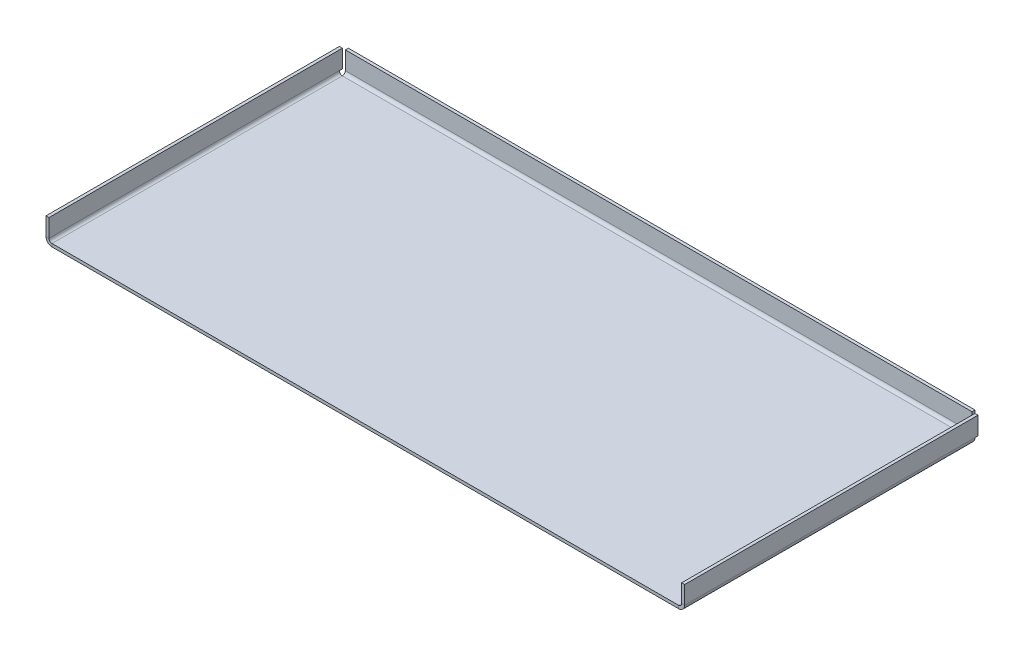
ISO-10303-21;
HEADER;
FILE_DESCRIPTION(('STEP AP214'),'2;1');
FILE_NAME('part.step','',(''),(''),'','','');
FILE_SCHEMA(('AUTOMOTIVE_DESIGN { 1 0 10303 214 1 1 1 1 }'));
ENDSEC;
DATA;
#1=APPLICATION_CONTEXT('core data for automotive mechanical design processes');
#2=APPLICATION_PROTOCOL_DEFINITION('international standard','automotive_design',2000,#1);
#3=PRODUCT_CONTEXT('',#1,'mechanical');
#4=PRODUCT('Part','Part','',(#3));
#5=PRODUCT_RELATED_PRODUCT_CATEGORY('part','',(#4));
#6=PRODUCT_DEFINITION_FORMATION('','',#4);
#7=PRODUCT_DEFINITION_CONTEXT('part definition',#1,'design');
#8=PRODUCT_DEFINITION('design','',#6,#7);
#9=PRODUCT_DEFINITION_SHAPE('','',#8);
#10=(LENGTH_UNIT() NAMED_UNIT(*) SI_UNIT(.MILLI.,.METRE.));
#11=(NAMED_UNIT(*) PLANE_ANGLE_UNIT() SI_UNIT($,.RADIAN.));
#12=(NAMED_UNIT(*) SI_UNIT($,.STERADIAN.) SOLID_ANGLE_UNIT());
#13=UNCERTAINTY_MEASURE_WITH_UNIT(LENGTH_MEASURE(1.E-05),#10,'distance_accuracy_value','');
#14=(GEOMETRIC_REPRESENTATION_CONTEXT(3) GLOBAL_UNCERTAINTY_ASSIGNED_CONTEXT((#13)) GLOBAL_UNIT_ASSIGNED_CONTEXT((#10,
#11,#12)) REPRESENTATION_CONTEXT('',''));
#15=CARTESIAN_POINT('',(0.,0.,0.));
#16=DIRECTION('',(0.,0.,1.));
#17=DIRECTION('',(1.,0.,0.));
#18=AXIS2_PLACEMENT_3D('',#15,#16,#17);
#19=CARTESIAN_POINT('',(0.,3.17499999999998,0.));
#20=DIRECTION('',(0.,-1.,0.));
#21=DIRECTION('',(1.,0.,0.));
#22=AXIS2_PLACEMENT_3D('',#19,#20,#21);
#23=PLANE('',#22);
#24=DIRECTION('',(1.,0.,0.));
#25=VECTOR('',#24,1.);
#26=CARTESIAN_POINT('',(0.,3.17499999999998,-307.467));
#27=LINE('',#26,#25);
#28=CARTESIAN_POINT('',(0.,3.17499999999998,-307.467));
#29=VERTEX_POINT('',#28);
#30=CARTESIAN_POINT('',(3.17499999999999,3.17499999999999,-307.467));
#31=VERTEX_POINT('',#30);
#32=EDGE_CURVE('E13',#29,#31,#27,.T.);
#33=ORIENTED_EDGE('',*,*,#32,.F.);
#34=DIRECTION('',(0.,0.,1.));
#35=VECTOR('',#34,1.);
#36=CARTESIAN_POINT('',(0.,3.17499999999998,0.));
#37=LINE('',#36,#35);
#38=CARTESIAN_POINT('',(0.,3.17499999999998,-310.642));
#39=VERTEX_POINT('',#38);
#40=EDGE_CURVE('E289',#39,#29,#37,.T.);
#41=ORIENTED_EDGE('',*,*,#40,.F.);
#42=DIRECTION('',(1.,0.,0.));
#43=VECTOR('',#42,1.);
#44=CARTESIAN_POINT('',(0.,3.17499999999998,-310.642));
#45=LINE('',#44,#43);
#46=CARTESIAN_POINT('',(3.17499999999999,3.17499999999999,-310.642));
#47=VERTEX_POINT('',#46);
#48=EDGE_CURVE('E265',#47,#39,#45,.F.);
#49=ORIENTED_EDGE('',*,*,#48,.F.);
#50=DIRECTION('',(0.,0.,-1.));
#51=VECTOR('',#50,1.);
#52=CARTESIAN_POINT('',(3.17499999999999,3.17499999999999,-310.642));
#53=LINE('',#52,#51);
#54=EDGE_CURVE('E296',#47,#31,#53,.F.);
#55=ORIENTED_EDGE('',*,*,#54,.T.);
#56=EDGE_LOOP('',(#33,#41,#49,#55));
#57=FACE_BOUND('',#56,.T.);
#58=ADVANCED_FACE('F82',(#57),#23,.T.);
#59=CARTESIAN_POINT('',(6.35000000000001,3.175,0.));
#60=DIRECTION('',(0.,0.,1.));
#61=DIRECTION('',(-1.,0.,0.));
#62=AXIS2_PLACEMENT_3D('',#59,#60,#61);
#63=CYLINDRICAL_SURFACE('',#62,6.34999999999998);
#64=CARTESIAN_POINT('',(0.,3.17499999999998,0.));
#65=VERTEX_POINT('',#64);
#66=EDGE_CURVE('E292',#29,#65,#37,.T.);
#67=ORIENTED_EDGE('',*,*,#66,.F.);
#68=CARTESIAN_POINT('',(6.34999999999997,3.175,-307.467));
#69=DIRECTION('',(0.,0.,-1.));
#70=DIRECTION('',(0.,1.,0.));
#71=AXIS2_PLACEMENT_3D('',#68,#69,#70);
#72=CIRCLE('',#71,6.34999999999998);
#73=CARTESIAN_POINT('',(6.34999999999985,-3.17500000000051,-307.467));
#74=VERTEX_POINT('',#73);
#75=EDGE_CURVE('E375',#29,#74,#72,.F.);
#76=ORIENTED_EDGE('',*,*,#75,.T.);
#77=DIRECTION('',(0.,0.,1.));
#78=VECTOR('',#77,1.);
#79=CARTESIAN_POINT('',(6.34999999999997,-3.17499999999998,0.));
#80=LINE('',#79,#78);
#81=CARTESIAN_POINT('',(6.34999999999997,-3.17499999999998,0.));
#82=VERTEX_POINT('',#81);
#83=EDGE_CURVE('E301',#82,#74,#80,.F.);
#84=ORIENTED_EDGE('',*,*,#83,.F.);
#85=CARTESIAN_POINT('',(6.35000000000001,3.175,0.));
#86=DIRECTION('',(0.,0.,1.));
#87=DIRECTION('',(1.,0.,0.));
#88=AXIS2_PLACEMENT_3D('',#85,#86,#87);
#89=CIRCLE('',#88,6.34999999999998);
#90=EDGE_CURVE('E305',#65,#82,#89,.T.);
#91=ORIENTED_EDGE('',*,*,#90,.F.);
#92=EDGE_LOOP('',(#67,#76,#84,#91));
#93=FACE_BOUND('',#92,.T.);
#94=ADVANCED_FACE('F409',(#93),#63,.T.);
#95=CARTESIAN_POINT('',(0.,3.17500000000344,0.));
#96=DIRECTION('',(0.,1.,0.));
#97=DIRECTION('',(-1.,0.,0.));
#98=AXIS2_PLACEMENT_3D('',#95,#96,#97);
#99=PLANE('',#98);
#100=DIRECTION('',(1.,0.,0.));
#101=VECTOR('',#100,1.);
#102=CARTESIAN_POINT('',(673.110159999999,3.17500000000004,-307.467));
#103=LINE('',#102,#101);
#104=CARTESIAN_POINT('',(673.110159999999,3.17500000000004,-307.467));
#105=VERTEX_POINT('',#104);
#106=CARTESIAN_POINT('',(676.285159999999,3.17500000000002,-307.467));
#107=VERTEX_POINT('',#106);
#108=EDGE_CURVE('E373',#105,#107,#103,.T.);
#109=ORIENTED_EDGE('',*,*,#108,.F.);
#110=DIRECTION('',(0.,0.,-1.));
#111=VECTOR('',#110,1.);
#112=CARTESIAN_POINT('',(673.110160000001,3.17500000000004,-1.43659402730918E-12));
#113=LINE('',#112,#111);
#114=CARTESIAN_POINT('',(673.110160000001,3.17500000000004,-310.642));
#115=VERTEX_POINT('',#114);
#116=EDGE_CURVE('E346',#105,#115,#113,.T.);
#117=ORIENTED_EDGE('',*,*,#116,.T.);
#118=DIRECTION('',(-1.,0.,0.));
#119=VECTOR('',#118,1.);
#120=CARTESIAN_POINT('',(673.110159999999,3.17500000000004,-310.642));
#121=LINE('',#120,#119);
#122=CARTESIAN_POINT('',(676.285159999999,3.17500000000002,-310.642));
#123=VERTEX_POINT('',#122);
#124=EDGE_CURVE('E341',#115,#123,#121,.F.);
#125=ORIENTED_EDGE('',*,*,#124,.T.);
#126=DIRECTION('',(0.,0.,-1.));
#127=VECTOR('',#126,1.);
#128=CARTESIAN_POINT('',(676.285160000001,3.17500000000002,-1.45021082646648E-12));
#129=LINE('',#128,#127);
#130=EDGE_CURVE('E337',#123,#107,#129,.F.);
#131=ORIENTED_EDGE('',*,*,#130,.T.);
#132=EDGE_LOOP('',(#109,#117,#125,#131));
#133=FACE_BOUND('',#132,.T.);
#134=ADVANCED_FACE('F448',(#133),#99,.F.);
#135=CARTESIAN_POINT('',(669.93516,3.17500000000005,-310.642));
#136=DIRECTION('',(0.,0.,-1.));
#137=DIRECTION('',(1.,0.,0.));
#138=AXIS2_PLACEMENT_3D('',#135,#136,#137);
#139=CYLINDRICAL_SURFACE('',#138,6.3500000000007);
#140=DIRECTION('',(0.,0.,-1.));
#141=VECTOR('',#140,1.);
#142=CARTESIAN_POINT('',(669.935159999999,-3.17500000000065,-310.642));
#143=LINE('',#142,#141);
#144=CARTESIAN_POINT('',(669.935159999999,-3.17500000000065,-307.467));
#145=VERTEX_POINT('',#144);
#146=CARTESIAN_POINT('',(669.935159999999,-3.175,0.));
#147=VERTEX_POINT('',#146);
#148=EDGE_CURVE('E349',#145,#147,#143,.F.);
#149=ORIENTED_EDGE('',*,*,#148,.F.);
#150=CARTESIAN_POINT('',(669.93516,3.17500000000005,-307.467));
#151=DIRECTION('',(0.,0.,-1.));
#152=DIRECTION('',(0.,1.,0.));
#153=AXIS2_PLACEMENT_3D('',#150,#151,#152);
#154=CIRCLE('',#153,6.3500000000007);
#155=EDGE_CURVE('E370',#145,#107,#154,.F.);
#156=ORIENTED_EDGE('',*,*,#155,.T.);
#157=CARTESIAN_POINT('',(676.285160000001,3.17500000000002,0.));
#158=VERTEX_POINT('',#157);
#159=EDGE_CURVE('E340',#107,#158,#129,.F.);
#160=ORIENTED_EDGE('',*,*,#159,.T.);
#161=CARTESIAN_POINT('',(669.93516,3.17500000000005,0.));
#162=DIRECTION('',(0.,0.,-1.));
#163=DIRECTION('',(-1.,0.,0.));
#164=AXIS2_PLACEMENT_3D('',#161,#162,#163);
#165=CIRCLE('',#164,6.3500000000007);
#166=EDGE_CURVE('E351',#147,#158,#165,.F.);
#167=ORIENTED_EDGE('',*,*,#166,.F.);
#168=EDGE_LOOP('',(#149,#156,#160,#167));
#169=FACE_BOUND('',#168,.T.);
#170=ADVANCED_FACE('F419',(#169),#139,.T.);
#171=CARTESIAN_POINT('',(669.93516,3.17500000000005,-307.467));
#172=DIRECTION('',(0.,0.,-1.));
#173=DIRECTION('',(0.,1.,0.));
#174=AXIS2_PLACEMENT_3D('',#171,#172,#173);
#175=PLANE('',#174);
#176=CARTESIAN_POINT('',(669.93516,3.17500000000005,-307.467));
#177=DIRECTION('',(0.,0.,-1.));
#178=DIRECTION('',(0.,1.,0.));
#179=AXIS2_PLACEMENT_3D('',#176,#177,#178);
#180=CIRCLE('',#179,3.17500000000071);
#181=CARTESIAN_POINT('',(669.935159999999,-1.1440501324067E-12,-307.467));
#182=VERTEX_POINT('',#181);
#183=EDGE_CURVE('E365',#182,#105,#180,.F.);
#184=ORIENTED_EDGE('',*,*,#183,.T.);
#185=ORIENTED_EDGE('',*,*,#108,.T.);
#186=ORIENTED_EDGE('',*,*,#155,.F.);
#187=DIRECTION('',(0.,-1.,0.));
#188=VECTOR('',#187,1.);
#189=CARTESIAN_POINT('',(669.935159999999,-1.1440501324067E-12,-307.467));
#190=LINE('',#189,#188);
#191=EDGE_CURVE('E262',#182,#145,#190,.T.);
#192=ORIENTED_EDGE('',*,*,#191,.F.);
#193=EDGE_LOOP('',(#184,#185,#186,#192));
#194=FACE_BOUND('',#193,.T.);
#195=ADVANCED_FACE('F486',(#194),#175,.T.);
#196=CARTESIAN_POINT('',(0.,-3.175,0.));
#197=DIRECTION('',(0.,-1.,0.));
#198=DIRECTION('',(0.,0.,-1.));
#199=AXIS2_PLACEMENT_3D('',#196,#197,#198);
#200=PLANE('',#199);
#201=ORIENTED_EDGE('',*,*,#83,.T.);
#202=DIRECTION('',(-1.,0.,0.));
#203=VECTOR('',#202,1.);
#204=CARTESIAN_POINT('',(6.34999999999985,-3.17500000000051,-307.467));
#205=LINE('',#204,#203);
#206=EDGE_CURVE('E209',#74,#145,#205,.F.);
#207=ORIENTED_EDGE('',*,*,#206,.T.);
#208=ORIENTED_EDGE('',*,*,#148,.T.);
#209=DIRECTION('',(1.,0.,0.));
#210=VECTOR('',#209,1.);
#211=CARTESIAN_POINT('',(0.,-3.175,0.));
#212=LINE('',#211,#210);
#213=EDGE_CURVE('E362',#82,#147,#212,.T.);
#214=ORIENTED_EDGE('',*,*,#213,.F.);
#215=EDGE_LOOP('',(#201,#207,#208,#214));
#216=FACE_BOUND('',#215,.T.);
#217=ADVANCED_FACE('F415',(#216),#200,.T.);
#218=CARTESIAN_POINT('',(0.,0.,0.));
#219=DIRECTION('',(0.,-1.,0.));
#220=DIRECTION('',(0.,0.,-1.));
#221=AXIS2_PLACEMENT_3D('',#218,#219,#220);
#222=PLANE('',#221);
#223=DIRECTION('',(-1.,0.,0.));
#224=VECTOR('',#223,1.);
#225=CARTESIAN_POINT('',(6.34999999999985,-5.09575021068187E-13,-307.467));
#226=LINE('',#225,#224);
#227=CARTESIAN_POINT('',(6.34999999999985,-5.09575021068187E-13,-307.467));
#228=VERTEX_POINT('',#227);
#229=EDGE_CURVE('E259',#228,#182,#226,.F.);
#230=ORIENTED_EDGE('',*,*,#229,.F.);
#231=DIRECTION('',(0.,0.,1.));
#232=VECTOR('',#231,1.);
#233=CARTESIAN_POINT('',(6.34999999999999,0.,0.));
#234=LINE('',#233,#232);
#235=CARTESIAN_POINT('',(6.34999999999999,0.,0.));
#236=VERTEX_POINT('',#235);
#237=EDGE_CURVE('E308',#236,#228,#234,.F.);
#238=ORIENTED_EDGE('',*,*,#237,.F.);
#239=DIRECTION('',(1.,0.,0.));
#240=VECTOR('',#239,1.);
#241=CARTESIAN_POINT('',(0.,0.,0.));
#242=LINE('',#241,#240);
#243=CARTESIAN_POINT('',(669.935159999999,-6.50087622622308E-13,0.));
#244=VERTEX_POINT('',#243);
#245=EDGE_CURVE('E361',#236,#244,#242,.T.);
#246=ORIENTED_EDGE('',*,*,#245,.T.);
#247=DIRECTION('',(0.,0.,-1.));
#248=VECTOR('',#247,1.);
#249=CARTESIAN_POINT('',(669.935159999999,-6.50087622622308E-13,-310.642));
#250=LINE('',#249,#248);
#251=EDGE_CURVE('E319',#182,#244,#250,.F.);
#252=ORIENTED_EDGE('',*,*,#251,.F.);
#253=EDGE_LOOP('',(#230,#238,#246,#252));
#254=FACE_BOUND('',#253,.T.);
#255=ADVANCED_FACE('F383',(#254),#222,.F.);
#256=CARTESIAN_POINT('',(0.,-3.175,0.));
#257=DIRECTION('',(0.,0.,1.));
#258=DIRECTION('',(1.,0.,0.));
#259=AXIS2_PLACEMENT_3D('',#256,#257,#258);
#260=PLANE('',#259);
#261=ORIENTED_EDGE('',*,*,#245,.F.);
#262=DIRECTION('',(0.,-1.,0.));
#263=VECTOR('',#262,1.);
#264=CARTESIAN_POINT('',(6.34999999999999,0.,0.));
#265=LINE('',#264,#263);
#266=EDGE_CURVE('E304',#236,#82,#265,.T.);
#267=ORIENTED_EDGE('',*,*,#266,.T.);
#268=ORIENTED_EDGE('',*,*,#213,.T.);
#269=DIRECTION('',(-2.09805925913369E-13,-1.,0.));
#270=VECTOR('',#269,1.);
#271=CARTESIAN_POINT('',(669.935159999999,-6.50087622622308E-13,0.));
#272=LINE('',#271,#270);
#273=EDGE_CURVE('E355',#244,#147,#272,.T.);
#274=ORIENTED_EDGE('',*,*,#273,.F.);
#275=EDGE_LOOP('',(#261,#267,#268,#274));
#276=FACE_BOUND('',#275,.T.);
#277=ADVANCED_FACE('F412',(#276),#260,.T.);
#278=CARTESIAN_POINT('',(669.93516,3.17500000000005,0.));
#279=DIRECTION('',(0.,0.,1.));
#280=DIRECTION('',(1.,0.,0.));
#281=AXIS2_PLACEMENT_3D('',#278,#279,#280);
#282=PLANE('',#281);
#283=DIRECTION('',(-1.,0.,0.));
#284=VECTOR('',#283,1.);
#285=CARTESIAN_POINT('',(676.285160000001,3.17500000000002,-4.14345970608878E-13));
#286=LINE('',#285,#284);
#287=CARTESIAN_POINT('',(673.110160000001,3.17500000000004,0.));
#288=VERTEX_POINT('',#287);
#289=EDGE_CURVE('E315',#288,#158,#286,.F.);
#290=ORIENTED_EDGE('',*,*,#289,.F.);
#291=CARTESIAN_POINT('',(669.93516,3.17500000000005,0.));
#292=DIRECTION('',(0.,0.,-1.));
#293=DIRECTION('',(-1.,0.,0.));
#294=AXIS2_PLACEMENT_3D('',#291,#292,#293);
#295=CIRCLE('',#294,3.17500000000071);
#296=EDGE_CURVE('E352',#244,#288,#295,.F.);
#297=ORIENTED_EDGE('',*,*,#296,.F.);
#298=ORIENTED_EDGE('',*,*,#273,.T.);
#299=ORIENTED_EDGE('',*,*,#166,.T.);
#300=EDGE_LOOP('',(#290,#297,#298,#299));
#301=FACE_BOUND('',#300,.T.);
#302=ADVANCED_FACE('F423',(#301),#282,.T.);
#303=CARTESIAN_POINT('',(669.93516,3.17500000000005,-310.642));
#304=DIRECTION('',(0.,0.,-1.));
#305=DIRECTION('',(1.,0.,0.));
#306=AXIS2_PLACEMENT_3D('',#303,#304,#305);
#307=CYLINDRICAL_SURFACE('',#306,3.17500000000071);
#308=ORIENTED_EDGE('',*,*,#183,.F.);
#309=ORIENTED_EDGE('',*,*,#251,.T.);
#310=ORIENTED_EDGE('',*,*,#296,.T.);
#311=EDGE_CURVE('E343',#288,#105,#113,.T.);
#312=ORIENTED_EDGE('',*,*,#311,.T.);
#313=EDGE_LOOP('',(#308,#309,#310,#312));
#314=FACE_BOUND('',#313,.T.);
#315=ADVANCED_FACE('F427',(#314),#307,.F.);
#316=CARTESIAN_POINT('',(676.28516,22.225,-310.642));
#317=DIRECTION('',(0.,0.,1.));
#318=DIRECTION('',(1.,0.,0.));
#319=AXIS2_PLACEMENT_3D('',#316,#317,#318);
#320=PLANE('',#319);
#321=ORIENTED_EDGE('',*,*,#124,.F.);
#322=DIRECTION('',(0.,-1.,0.));
#323=VECTOR('',#322,1.);
#324=CARTESIAN_POINT('',(673.11016,22.225,-310.642));
#325=LINE('',#324,#323);
#326=CARTESIAN_POINT('',(673.11016,22.225,-310.642));
#327=VERTEX_POINT('',#326);
#328=EDGE_CURVE('E335',#115,#327,#325,.F.);
#329=ORIENTED_EDGE('',*,*,#328,.T.);
#330=DIRECTION('',(-1.,0.,0.));
#331=VECTOR('',#330,1.);
#332=CARTESIAN_POINT('',(676.28516,22.225,-310.642));
#333=LINE('',#332,#331);
#334=CARTESIAN_POINT('',(676.28516,22.225,-310.642));
#335=VERTEX_POINT('',#334);
#336=EDGE_CURVE('E316',#335,#327,#333,.T.);
#337=ORIENTED_EDGE('',*,*,#336,.F.);
#338=DIRECTION('',(0.,1.,0.));
#339=VECTOR('',#338,1.);
#340=CARTESIAN_POINT('',(676.285159999999,-3.3893862669485E-12,-310.642));
#341=LINE('',#340,#339);
#342=EDGE_CURVE('E328',#123,#335,#341,.T.);
#343=ORIENTED_EDGE('',*,*,#342,.F.);
#344=EDGE_LOOP('',(#321,#329,#337,#343));
#345=FACE_BOUND('',#344,.T.);
#346=ADVANCED_FACE('F444',(#345),#320,.F.);
#347=CARTESIAN_POINT('',(676.285160000001,0.,0.));
#348=DIRECTION('',(0.,-1.30502667908306E-13,-1.));
#349=DIRECTION('',(0.,1.,-1.30502667908306E-13));
#350=AXIS2_PLACEMENT_3D('',#347,#348,#349);
#351=PLANE('',#350);
#352=ORIENTED_EDGE('',*,*,#289,.T.);
#353=DIRECTION('',(0.,-1.,1.30502667908306E-13));
#354=VECTOR('',#353,1.);
#355=CARTESIAN_POINT('',(676.285160000001,-3.3893862669485E-12,-2.90042179426211E-12));
#356=LINE('',#355,#354);
#357=CARTESIAN_POINT('',(676.285160000001,22.225,-4.35063269139339E-12));
#358=VERTEX_POINT('',#357);
#359=EDGE_CURVE('E323',#358,#158,#356,.T.);
#360=ORIENTED_EDGE('',*,*,#359,.F.);
#361=DIRECTION('',(-1.,0.,0.));
#362=VECTOR('',#361,1.);
#363=CARTESIAN_POINT('',(676.285160000001,22.225,-2.90042179426211E-12));
#364=LINE('',#363,#362);
#365=CARTESIAN_POINT('',(673.110160000001,22.225,-2.88680499510481E-12));
#366=VERTEX_POINT('',#365);
#367=EDGE_CURVE('E320',#358,#366,#364,.T.);
#368=ORIENTED_EDGE('',*,*,#367,.T.);
#369=DIRECTION('',(0.,1.,-1.30502667908306E-13));
#370=VECTOR('',#369,1.);
#371=CARTESIAN_POINT('',(673.110160000001,0.,0.));
#372=LINE('',#371,#370);
#373=EDGE_CURVE('E330',#366,#288,#372,.F.);
#374=ORIENTED_EDGE('',*,*,#373,.T.);
#375=EDGE_LOOP('',(#352,#360,#368,#374));
#376=FACE_BOUND('',#375,.T.);
#377=ADVANCED_FACE('F435',(#376),#351,.F.);
#378=CARTESIAN_POINT('',(676.285160000001,-3.3893862669485E-12,-2.90042179426211E-12));
#379=DIRECTION('',(-1.,0.,0.));
#380=DIRECTION('',(0.,-1.,0.));
#381=AXIS2_PLACEMENT_3D('',#378,#379,#380);
#382=PLANE('',#381);
#383=ORIENTED_EDGE('',*,*,#130,.F.);
#384=ORIENTED_EDGE('',*,*,#342,.T.);
#385=DIRECTION('',(0.,0.,1.));
#386=VECTOR('',#385,1.);
#387=CARTESIAN_POINT('',(676.285160000001,22.225,-2.90042179426211E-12));
#388=LINE('',#387,#386);
#389=EDGE_CURVE('E326',#335,#358,#388,.T.);
#390=ORIENTED_EDGE('',*,*,#389,.T.);
#391=ORIENTED_EDGE('',*,*,#359,.T.);
#392=ORIENTED_EDGE('',*,*,#159,.F.);
#393=EDGE_LOOP('',(#383,#384,#390,#391,#392));
#394=FACE_BOUND('',#393,.T.);
#395=ADVANCED_FACE('F450',(#394),#382,.F.);
#396=CARTESIAN_POINT('',(673.110160000001,-3.37830081369768E-12,-2.88680499510481E-12));
#397=DIRECTION('',(-1.,0.,0.));
#398=DIRECTION('',(0.,-1.,0.));
#399=AXIS2_PLACEMENT_3D('',#396,#397,#398);
#400=PLANE('',#399);
#401=ORIENTED_EDGE('',*,*,#328,.F.);
#402=ORIENTED_EDGE('',*,*,#116,.F.);
#403=ORIENTED_EDGE('',*,*,#311,.F.);
#404=ORIENTED_EDGE('',*,*,#373,.F.);
#405=DIRECTION('',(0.,0.,-1.));
#406=VECTOR('',#405,1.);
#407=CARTESIAN_POINT('',(673.110160000001,22.225,-2.88680499510481E-12));
#408=LINE('',#407,#406);
#409=EDGE_CURVE('E333',#327,#366,#408,.F.);
#410=ORIENTED_EDGE('',*,*,#409,.F.);
#411=EDGE_LOOP('',(#401,#402,#403,#404,#410));
#412=FACE_BOUND('',#411,.T.);
#413=ADVANCED_FACE('F432',(#412),#400,.T.);
#414=CARTESIAN_POINT('',(676.285160000001,22.225,-2.90042179426211E-12));
#415=DIRECTION('',(0.,-1.,0.));
#416=DIRECTION('',(1.,0.,0.));
#417=AXIS2_PLACEMENT_3D('',#414,#415,#416);
#418=PLANE('',#417);
#419=ORIENTED_EDGE('',*,*,#409,.T.);
#420=ORIENTED_EDGE('',*,*,#367,.F.);
#421=ORIENTED_EDGE('',*,*,#389,.F.);
#422=ORIENTED_EDGE('',*,*,#336,.T.);
#423=EDGE_LOOP('',(#419,#420,#421,#422));
#424=FACE_BOUND('',#423,.T.);
#425=ADVANCED_FACE('F440',(#424),#418,.F.);
#426=CARTESIAN_POINT('',(6.35000000000001,3.175,0.));
#427=DIRECTION('',(0.,0.,-1.));
#428=DIRECTION('',(-1.,0.,0.));
#429=AXIS2_PLACEMENT_3D('',#426,#427,#428);
#430=PLANE('',#429);
#431=CARTESIAN_POINT('',(6.35000000000001,3.175,0.));
#432=DIRECTION('',(0.,0.,1.));
#433=DIRECTION('',(1.,0.,0.));
#434=AXIS2_PLACEMENT_3D('',#431,#432,#433);
#435=CIRCLE('',#434,3.17499999999998);
#436=CARTESIAN_POINT('',(3.17500000000003,3.17499999999999,0.));
#437=VERTEX_POINT('',#436);
#438=EDGE_CURVE('E271',#437,#236,#435,.T.);
#439=ORIENTED_EDGE('',*,*,#438,.F.);
#440=DIRECTION('',(1.,0.,0.));
#441=VECTOR('',#440,1.);
#442=CARTESIAN_POINT('',(3.17499999999999,3.17499999999999,0.));
#443=LINE('',#442,#441);
#444=EDGE_CURVE('E293',#437,#65,#443,.F.);
#445=ORIENTED_EDGE('',*,*,#444,.T.);
#446=ORIENTED_EDGE('',*,*,#90,.T.);
#447=ORIENTED_EDGE('',*,*,#266,.F.);
#448=EDGE_LOOP('',(#439,#445,#446,#447));
#449=FACE_BOUND('',#448,.T.);
#450=ADVANCED_FACE('F391',(#449),#430,.F.);
#451=CARTESIAN_POINT('',(6.34999999999997,3.175,-307.467));
#452=DIRECTION('',(0.,0.,-1.));
#453=DIRECTION('',(0.,1.,0.));
#454=AXIS2_PLACEMENT_3D('',#451,#452,#453);
#455=PLANE('',#454);
#456=ORIENTED_EDGE('',*,*,#75,.F.);
#457=ORIENTED_EDGE('',*,*,#32,.T.);
#458=CARTESIAN_POINT('',(6.34999999999997,3.175,-307.467));
#459=DIRECTION('',(0.,0.,-1.));
#460=DIRECTION('',(0.,1.,0.));
#461=AXIS2_PLACEMENT_3D('',#458,#459,#460);
#462=CIRCLE('',#461,3.17499999999998);
#463=EDGE_CURVE('E89',#31,#228,#462,.F.);
#464=ORIENTED_EDGE('',*,*,#463,.T.);
#465=DIRECTION('',(0.,-1.,0.));
#466=VECTOR('',#465,1.);
#467=CARTESIAN_POINT('',(6.34999999999985,-5.09575021068187E-13,-307.467));
#468=LINE('',#467,#466);
#469=EDGE_CURVE('E255',#228,#74,#468,.T.);
#470=ORIENTED_EDGE('',*,*,#469,.T.);
#471=EDGE_LOOP('',(#456,#457,#464,#470));
#472=FACE_BOUND('',#471,.T.);
#473=ADVANCED_FACE('F377',(#472),#455,.T.);
#474=CARTESIAN_POINT('',(6.35000000000001,3.175,0.));
#475=DIRECTION('',(0.,0.,1.));
#476=DIRECTION('',(-1.,0.,0.));
#477=AXIS2_PLACEMENT_3D('',#474,#475,#476);
#478=CYLINDRICAL_SURFACE('',#477,3.17499999999998);
#479=ORIENTED_EDGE('',*,*,#463,.F.);
#480=EDGE_CURVE('E298',#31,#437,#53,.F.);
#481=ORIENTED_EDGE('',*,*,#480,.T.);
#482=ORIENTED_EDGE('',*,*,#438,.T.);
#483=ORIENTED_EDGE('',*,*,#237,.T.);
#484=EDGE_LOOP('',(#479,#481,#482,#483));
#485=FACE_BOUND('',#484,.T.);
#486=ADVANCED_FACE('F387',(#485),#478,.F.);
#487=CARTESIAN_POINT('',(0.,0.,0.));
#488=DIRECTION('',(0.,0.,-1.));
#489=DIRECTION('',(0.,1.,0.));
#490=AXIS2_PLACEMENT_3D('',#487,#488,#489);
#491=PLANE('',#490);
#492=ORIENTED_EDGE('',*,*,#444,.F.);
#493=DIRECTION('',(0.,1.,0.));
#494=VECTOR('',#493,1.);
#495=CARTESIAN_POINT('',(3.175,0.,0.));
#496=LINE('',#495,#494);
#497=CARTESIAN_POINT('',(3.17499999999992,22.225,0.));
#498=VERTEX_POINT('',#497);
#499=EDGE_CURVE('E287',#437,#498,#496,.T.);
#500=ORIENTED_EDGE('',*,*,#499,.T.);
#501=DIRECTION('',(1.,0.,0.));
#502=VECTOR('',#501,1.);
#503=CARTESIAN_POINT('',(0.,22.225,0.));
#504=LINE('',#503,#502);
#505=CARTESIAN_POINT('',(0.,22.225,0.));
#506=VERTEX_POINT('',#505);
#507=EDGE_CURVE('E268',#506,#498,#504,.T.);
#508=ORIENTED_EDGE('',*,*,#507,.F.);
#509=DIRECTION('',(0.,-1.,0.));
#510=VECTOR('',#509,1.);
#511=CARTESIAN_POINT('',(0.,0.,0.));
#512=LINE('',#511,#510);
#513=EDGE_CURVE('E280',#65,#506,#512,.F.);
#514=ORIENTED_EDGE('',*,*,#513,.F.);
#515=EDGE_LOOP('',(#492,#500,#508,#514));
#516=FACE_BOUND('',#515,.T.);
#517=ADVANCED_FACE('F401',(#516),#491,.F.);
#518=CARTESIAN_POINT('',(0.,22.225,-310.642));
#519=DIRECTION('',(0.,0.,1.));
#520=DIRECTION('',(1.,0.,0.));
#521=AXIS2_PLACEMENT_3D('',#518,#519,#520);
#522=PLANE('',#521);
#523=ORIENTED_EDGE('',*,*,#48,.T.);
#524=DIRECTION('',(0.,1.,0.));
#525=VECTOR('',#524,1.);
#526=CARTESIAN_POINT('',(0.,0.,-310.642));
#527=LINE('',#526,#525);
#528=CARTESIAN_POINT('',(0.,22.225,-310.642));
#529=VERTEX_POINT('',#528);
#530=EDGE_CURVE('E275',#529,#39,#527,.F.);
#531=ORIENTED_EDGE('',*,*,#530,.F.);
#532=DIRECTION('',(1.,0.,0.));
#533=VECTOR('',#532,1.);
#534=CARTESIAN_POINT('',(0.,22.225,-310.642));
#535=LINE('',#534,#533);
#536=CARTESIAN_POINT('',(3.17499999999992,22.225,-310.642));
#537=VERTEX_POINT('',#536);
#538=EDGE_CURVE('E272',#529,#537,#535,.T.);
#539=ORIENTED_EDGE('',*,*,#538,.T.);
#540=DIRECTION('',(0.,-1.,0.));
#541=VECTOR('',#540,1.);
#542=CARTESIAN_POINT('',(3.17499999999992,22.225,-310.642));
#543=LINE('',#542,#541);
#544=EDGE_CURVE('E282',#537,#47,#543,.T.);
#545=ORIENTED_EDGE('',*,*,#544,.T.);
#546=EDGE_LOOP('',(#523,#531,#539,#545));
#547=FACE_BOUND('',#546,.T.);
#548=ADVANCED_FACE('F542',(#547),#522,.F.);
#549=CARTESIAN_POINT('',(0.,0.,0.));
#550=DIRECTION('',(-1.,0.,0.));
#551=DIRECTION('',(0.,-1.,0.));
#552=AXIS2_PLACEMENT_3D('',#549,#550,#551);
#553=PLANE('',#552);
#554=ORIENTED_EDGE('',*,*,#530,.T.);
#555=ORIENTED_EDGE('',*,*,#40,.T.);
#556=ORIENTED_EDGE('',*,*,#66,.T.);
#557=ORIENTED_EDGE('',*,*,#513,.T.);
#558=DIRECTION('',(0.,0.,1.));
#559=VECTOR('',#558,1.);
#560=CARTESIAN_POINT('',(0.,22.225,0.));
#561=LINE('',#560,#559);
#562=EDGE_CURVE('E278',#506,#529,#561,.F.);
#563=ORIENTED_EDGE('',*,*,#562,.T.);
#564=EDGE_LOOP('',(#554,#555,#556,#557,#563));
#565=FACE_BOUND('',#564,.T.);
#566=ADVANCED_FACE('F404',(#565),#553,.T.);
#567=CARTESIAN_POINT('',(3.175,0.,0.));
#568=DIRECTION('',(-1.,0.,0.));
#569=DIRECTION('',(0.,-1.,0.));
#570=AXIS2_PLACEMENT_3D('',#567,#568,#569);
#571=PLANE('',#570);
#572=ORIENTED_EDGE('',*,*,#54,.F.);
#573=ORIENTED_EDGE('',*,*,#544,.F.);
#574=DIRECTION('',(0.,0.,-1.));
#575=VECTOR('',#574,1.);
#576=CARTESIAN_POINT('',(3.17499999999992,22.225,0.));
#577=LINE('',#576,#575);
#578=EDGE_CURVE('E285',#498,#537,#577,.T.);
#579=ORIENTED_EDGE('',*,*,#578,.F.);
#580=ORIENTED_EDGE('',*,*,#499,.F.);
#581=ORIENTED_EDGE('',*,*,#480,.F.);
#582=EDGE_LOOP('',(#572,#573,#579,#580,#581));
#583=FACE_BOUND('',#582,.T.);
#584=ADVANCED_FACE('F397',(#583),#571,.F.);
#585=CARTESIAN_POINT('',(0.,22.225,0.));
#586=DIRECTION('',(0.,-1.,0.));
#587=DIRECTION('',(1.,0.,0.));
#588=AXIS2_PLACEMENT_3D('',#585,#586,#587);
#589=PLANE('',#588);
#590=ORIENTED_EDGE('',*,*,#578,.T.);
#591=ORIENTED_EDGE('',*,*,#538,.F.);
#592=ORIENTED_EDGE('',*,*,#562,.F.);
#593=ORIENTED_EDGE('',*,*,#507,.T.);
#594=EDGE_LOOP('',(#590,#591,#592,#593));
#595=FACE_BOUND('',#594,.T.);
#596=ADVANCED_FACE('F537',(#595),#589,.F.);
#597=CARTESIAN_POINT('',(669.935159999999,3.17499999999928,-307.467));
#598=DIRECTION('',(1.,0.,0.));
#599=DIRECTION('',(0.,1.,0.));
#600=AXIS2_PLACEMENT_3D('',#597,#598,#599);
#601=PLANE('',#600);
#602=DIRECTION('',(0.,0.,-1.));
#603=VECTOR('',#602,1.);
#604=CARTESIAN_POINT('',(669.93516,3.17499999999932,-310.642));
#605=LINE('',#604,#603);
#606=CARTESIAN_POINT('',(669.935159999999,3.17499999999928,-310.642));
#607=VERTEX_POINT('',#606);
#608=CARTESIAN_POINT('',(669.935159999999,3.17499999999927,-313.817));
#609=VERTEX_POINT('',#608);
#610=EDGE_CURVE('E506',#607,#609,#605,.T.);
#611=ORIENTED_EDGE('',*,*,#610,.F.);
#612=CARTESIAN_POINT('',(669.935159999999,3.17499999999928,-307.467));
#613=DIRECTION('',(-1.,0.,0.));
#614=DIRECTION('',(0.,-1.,0.));
#615=AXIS2_PLACEMENT_3D('',#612,#613,#614);
#616=CIRCLE('',#615,3.17500000000043);
#617=EDGE_CURVE('E212',#182,#607,#616,.F.);
#618=ORIENTED_EDGE('',*,*,#617,.F.);
#619=ORIENTED_EDGE('',*,*,#191,.T.);
#620=CARTESIAN_POINT('',(669.935159999999,3.17499999999928,-307.467));
#621=DIRECTION('',(-1.,0.,0.));
#622=DIRECTION('',(0.,-1.,0.));
#623=AXIS2_PLACEMENT_3D('',#620,#621,#622);
#624=CIRCLE('',#623,6.35000000000043);
#625=EDGE_CURVE('E254',#145,#609,#624,.F.);
#626=ORIENTED_EDGE('',*,*,#625,.T.);
#627=EDGE_LOOP('',(#611,#618,#619,#626));
#628=FACE_BOUND('',#627,.T.);
#629=ADVANCED_FACE('F504',(#628),#601,.T.);
#630=CARTESIAN_POINT('',(6.34999999999986,3.17499999999992,-307.467));
#631=DIRECTION('',(1.,0.,0.));
#632=DIRECTION('',(0.,1.,0.));
#633=AXIS2_PLACEMENT_3D('',#630,#631,#632);
#634=PLANE('',#633);
#635=CARTESIAN_POINT('',(6.34999999999986,3.17499999999992,-307.467));
#636=DIRECTION('',(-1.,0.,0.));
#637=DIRECTION('',(0.,-1.,0.));
#638=AXIS2_PLACEMENT_3D('',#635,#636,#637);
#639=CIRCLE('',#638,3.17500000000043);
#640=CARTESIAN_POINT('',(6.34999999999986,3.17499999999991,-310.642));
#641=VERTEX_POINT('',#640);
#642=EDGE_CURVE('E219',#641,#228,#639,.T.);
#643=ORIENTED_EDGE('',*,*,#642,.F.);
#644=DIRECTION('',(0.,0.,-1.));
#645=VECTOR('',#644,1.);
#646=CARTESIAN_POINT('',(6.34999999999986,3.17499999999993,-310.641999999999));
#647=LINE('',#646,#645);
#648=CARTESIAN_POINT('',(6.34999999999986,3.17499999999995,-313.817));
#649=VERTEX_POINT('',#648);
#650=EDGE_CURVE('E216',#641,#649,#647,.T.);
#651=ORIENTED_EDGE('',*,*,#650,.T.);
#652=CARTESIAN_POINT('',(6.34999999999986,3.17499999999992,-307.467));
#653=DIRECTION('',(-1.,0.,0.));
#654=DIRECTION('',(0.,-1.,0.));
#655=AXIS2_PLACEMENT_3D('',#652,#653,#654);
#656=CIRCLE('',#655,6.35000000000043);
#657=EDGE_CURVE('E202',#649,#74,#656,.T.);
#658=ORIENTED_EDGE('',*,*,#657,.T.);
#659=ORIENTED_EDGE('',*,*,#469,.F.);
#660=EDGE_LOOP('',(#643,#651,#658,#659));
#661=FACE_BOUND('',#660,.T.);
#662=ADVANCED_FACE('F217',(#661),#634,.F.);
#663=CARTESIAN_POINT('',(6.34999999999986,3.17499999999992,-307.467));
#664=DIRECTION('',(-1.,0.,0.));
#665=DIRECTION('',(0.,0.,-1.));
#666=AXIS2_PLACEMENT_3D('',#663,#664,#665);
#667=CYLINDRICAL_SURFACE('',#666,6.35000000000043);
#668=ORIENTED_EDGE('',*,*,#206,.F.);
#669=ORIENTED_EDGE('',*,*,#657,.F.);
#670=DIRECTION('',(1.,0.,0.));
#671=VECTOR('',#670,1.);
#672=CARTESIAN_POINT('',(0.,3.17499999999996,-313.817));
#673=LINE('',#672,#671);
#674=EDGE_CURVE('E206',#649,#609,#673,.T.);
#675=ORIENTED_EDGE('',*,*,#674,.T.);
#676=ORIENTED_EDGE('',*,*,#625,.F.);
#677=EDGE_LOOP('',(#668,#669,#675,#676));
#678=FACE_BOUND('',#677,.T.);
#679=ADVANCED_FACE('F204',(#678),#667,.T.);
#680=CARTESIAN_POINT('',(6.34999999999986,3.17499999999992,-307.467));
#681=DIRECTION('',(-1.,0.,0.));
#682=DIRECTION('',(0.,0.,-1.));
#683=AXIS2_PLACEMENT_3D('',#680,#681,#682);
#684=CYLINDRICAL_SURFACE('',#683,3.17500000000043);
#685=ORIENTED_EDGE('',*,*,#229,.T.);
#686=ORIENTED_EDGE('',*,*,#617,.T.);
#687=DIRECTION('',(-1.,0.,0.));
#688=VECTOR('',#687,1.);
#689=CARTESIAN_POINT('',(669.93516,3.17499999999932,-310.642));
#690=LINE('',#689,#688);
#691=EDGE_CURVE('E223',#607,#641,#690,.T.);
#692=ORIENTED_EDGE('',*,*,#691,.T.);
#693=ORIENTED_EDGE('',*,*,#642,.T.);
#694=EDGE_LOOP('',(#685,#686,#692,#693));
#695=FACE_BOUND('',#694,.T.);
#696=ADVANCED_FACE('F508',(#695),#684,.F.);
#697=CARTESIAN_POINT('',(669.935159999999,-6.61173075873135E-13,-313.817));
#698=DIRECTION('',(-1.,0.,0.));
#699=DIRECTION('',(0.,-1.,0.));
#700=AXIS2_PLACEMENT_3D('',#697,#698,#699);
#701=PLANE('',#700);
#702=ORIENTED_EDGE('',*,*,#610,.T.);
#703=DIRECTION('',(0.,-1.,0.));
#704=VECTOR('',#703,1.);
#705=CARTESIAN_POINT('',(669.935159999999,-6.61173075873135E-13,-313.817));
#706=LINE('',#705,#704);
#707=CARTESIAN_POINT('',(669.93516,22.2249999999993,-313.817));
#708=VERTEX_POINT('',#707);
#709=EDGE_CURVE('E231',#708,#609,#706,.T.);
#710=ORIENTED_EDGE('',*,*,#709,.F.);
#711=DIRECTION('',(0.,0.,1.));
#712=VECTOR('',#711,1.);
#713=CARTESIAN_POINT('',(669.93516,22.2249999999993,-313.817));
#714=LINE('',#713,#712);
#715=CARTESIAN_POINT('',(669.93516,22.2249999999994,-310.642));
#716=VERTEX_POINT('',#715);
#717=EDGE_CURVE('E240',#708,#716,#714,.T.);
#718=ORIENTED_EDGE('',*,*,#717,.T.);
#719=DIRECTION('',(0.,-1.,0.));
#720=VECTOR('',#719,1.);
#721=CARTESIAN_POINT('',(669.935159999999,-6.50087622622308E-13,-310.642));
#722=LINE('',#721,#720);
#723=EDGE_CURVE('E232',#716,#607,#722,.T.);
#724=ORIENTED_EDGE('',*,*,#723,.T.);
#725=EDGE_LOOP('',(#702,#710,#718,#724));
#726=FACE_BOUND('',#725,.T.);
#727=ADVANCED_FACE('F515',(#726),#701,.F.);
#728=CARTESIAN_POINT('',(6.34999999999977,22.225,-313.817));
#729=DIRECTION('',(1.,0.,0.));
#730=DIRECTION('',(0.,1.,0.));
#731=AXIS2_PLACEMENT_3D('',#728,#729,#730);
#732=PLANE('',#731);
#733=ORIENTED_EDGE('',*,*,#650,.F.);
#734=DIRECTION('',(0.,1.,0.));
#735=VECTOR('',#734,1.);
#736=CARTESIAN_POINT('',(6.34999999999977,22.225,-310.642));
#737=LINE('',#736,#735);
#738=CARTESIAN_POINT('',(6.34999999999977,22.225,-310.642));
#739=VERTEX_POINT('',#738);
#740=EDGE_CURVE('E247',#641,#739,#737,.T.);
#741=ORIENTED_EDGE('',*,*,#740,.T.);
#742=DIRECTION('',(0.,0.,1.));
#743=VECTOR('',#742,1.);
#744=CARTESIAN_POINT('',(6.34999999999977,22.225,-313.817));
#745=LINE('',#744,#743);
#746=CARTESIAN_POINT('',(6.34999999999977,22.225,-313.817));
#747=VERTEX_POINT('',#746);
#748=EDGE_CURVE('E236',#747,#739,#745,.T.);
#749=ORIENTED_EDGE('',*,*,#748,.F.);
#750=DIRECTION('',(0.,1.,0.));
#751=VECTOR('',#750,1.);
#752=CARTESIAN_POINT('',(6.34999999999977,22.225,-313.817));
#753=LINE('',#752,#751);
#754=EDGE_CURVE('E228',#649,#747,#753,.T.);
#755=ORIENTED_EDGE('',*,*,#754,.F.);
#756=EDGE_LOOP('',(#733,#741,#749,#755));
#757=FACE_BOUND('',#756,.T.);
#758=ADVANCED_FACE('F234',(#757),#732,.F.);
#759=CARTESIAN_POINT('',(0.,-7.86972744174575E-13,-313.817));
#760=DIRECTION('',(0.,0.,1.));
#761=DIRECTION('',(0.,-1.,0.));
#762=AXIS2_PLACEMENT_3D('',#759,#760,#761);
#763=PLANE('',#762);
#764=ORIENTED_EDGE('',*,*,#674,.F.);
#765=ORIENTED_EDGE('',*,*,#754,.T.);
#766=DIRECTION('',(1.,0.,0.));
#767=VECTOR('',#766,1.);
#768=CARTESIAN_POINT('',(669.93516,22.2249999999993,-313.817));
#769=LINE('',#768,#767);
#770=EDGE_CURVE('E238',#747,#708,#769,.T.);
#771=ORIENTED_EDGE('',*,*,#770,.T.);
#772=ORIENTED_EDGE('',*,*,#709,.T.);
#773=EDGE_LOOP('',(#764,#765,#771,#772));
#774=FACE_BOUND('',#773,.T.);
#775=ADVANCED_FACE('F227',(#774),#763,.F.);
#776=CARTESIAN_POINT('',(0.,-7.75887290923748E-13,-310.642));
#777=DIRECTION('',(0.,0.,1.));
#778=DIRECTION('',(0.,-1.,0.));
#779=AXIS2_PLACEMENT_3D('',#776,#777,#778);
#780=PLANE('',#779);
#781=ORIENTED_EDGE('',*,*,#740,.F.);
#782=ORIENTED_EDGE('',*,*,#691,.F.);
#783=ORIENTED_EDGE('',*,*,#723,.F.);
#784=DIRECTION('',(1.,0.,0.));
#785=VECTOR('',#784,1.);
#786=CARTESIAN_POINT('',(669.93516,22.2249999999994,-310.642));
#787=LINE('',#786,#785);
#788=EDGE_CURVE('E242',#739,#716,#787,.T.);
#789=ORIENTED_EDGE('',*,*,#788,.F.);
#790=EDGE_LOOP('',(#781,#782,#783,#789));
#791=FACE_BOUND('',#790,.T.);
#792=ADVANCED_FACE('F511',(#791),#780,.T.);
#793=CARTESIAN_POINT('',(669.93516,22.2249999999993,-313.817));
#794=DIRECTION('',(0.,-1.,0.));
#795=DIRECTION('',(0.,0.,-1.));
#796=AXIS2_PLACEMENT_3D('',#793,#794,#795);
#797=PLANE('',#796);
#798=ORIENTED_EDGE('',*,*,#788,.T.);
#799=ORIENTED_EDGE('',*,*,#717,.F.);
#800=ORIENTED_EDGE('',*,*,#770,.F.);
#801=ORIENTED_EDGE('',*,*,#748,.T.);
#802=EDGE_LOOP('',(#798,#799,#800,#801));
#803=FACE_BOUND('',#802,.T.);
#804=ADVANCED_FACE('F518',(#803),#797,.F.);
#805=CLOSED_SHELL('',(#58,#94,#134,#170,#195,#217,#255,#277,#302,#315,#346,#377,#395,#413,#425,
#450,#473,#486,#517,#548,#566,#584,#596,#629,#662,#679,#696,#727,#758,#775,#792,#804));
#806=MANIFOLD_SOLID_BREP('B2',#805);
#807=ADVANCED_BREP_SHAPE_REPRESENTATION('',(#18,#806),#14);
#808=SHAPE_DEFINITION_REPRESENTATION(#9,#807);
ENDSEC;
END-ISO-10303-21;
